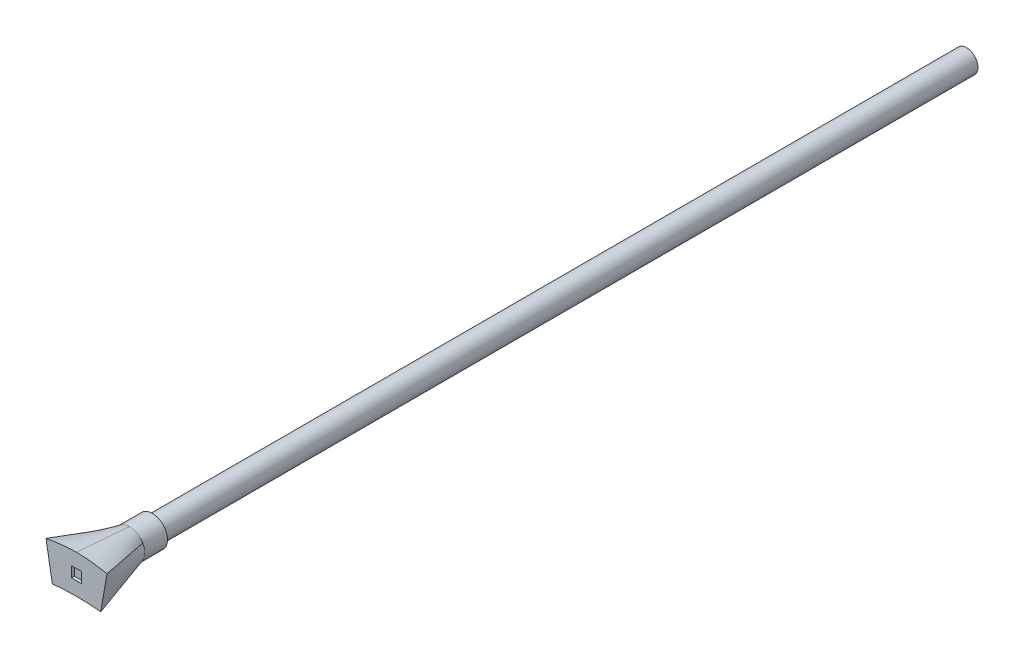
ISO-10303-21;
HEADER;
FILE_DESCRIPTION(('STEP AP214'),'2;1');
FILE_NAME('part.step','',(''),(''),'','','');
FILE_SCHEMA(('AUTOMOTIVE_DESIGN { 1 0 10303 214 1 1 1 1 }'));
ENDSEC;
DATA;
#1=APPLICATION_CONTEXT('core data for automotive mechanical design processes');
#2=APPLICATION_PROTOCOL_DEFINITION('international standard','automotive_design',2000,#1);
#3=PRODUCT_CONTEXT('',#1,'mechanical');
#4=PRODUCT('Part','Part','',(#3));
#5=PRODUCT_RELATED_PRODUCT_CATEGORY('part','',(#4));
#6=PRODUCT_DEFINITION_FORMATION('','',#4);
#7=PRODUCT_DEFINITION_CONTEXT('part definition',#1,'design');
#8=PRODUCT_DEFINITION('design','',#6,#7);
#9=PRODUCT_DEFINITION_SHAPE('','',#8);
#10=(LENGTH_UNIT() NAMED_UNIT(*) SI_UNIT(.MILLI.,.METRE.));
#11=(NAMED_UNIT(*) PLANE_ANGLE_UNIT() SI_UNIT($,.RADIAN.));
#12=(NAMED_UNIT(*) SI_UNIT($,.STERADIAN.) SOLID_ANGLE_UNIT());
#13=UNCERTAINTY_MEASURE_WITH_UNIT(LENGTH_MEASURE(1.E-05),#10,'distance_accuracy_value','');
#14=(GEOMETRIC_REPRESENTATION_CONTEXT(3) GLOBAL_UNCERTAINTY_ASSIGNED_CONTEXT((#13)) GLOBAL_UNIT_ASSIGNED_CONTEXT((#10,
#11,#12)) REPRESENTATION_CONTEXT('',''));
#15=CARTESIAN_POINT('',(0.,0.,0.));
#16=DIRECTION('',(0.,0.,1.));
#17=DIRECTION('',(1.,0.,0.));
#18=AXIS2_PLACEMENT_3D('',#15,#16,#17);
#19=CARTESIAN_POINT('',(0.,0.,19.05));
#20=DIRECTION('',(0.,0.,-1.));
#21=DIRECTION('',(-1.,0.,0.));
#22=AXIS2_PLACEMENT_3D('',#19,#20,#21);
#23=CYLINDRICAL_SURFACE('',#22,12.7);
#24=CARTESIAN_POINT('',(11.0617453760948,6.23921383144101,19.0499999999988));
#25=CARTESIAN_POINT('',(10.9739788417862,6.3948181918106,19.0499986454144));
#26=CARTESIAN_POINT('',(10.8829394737692,6.5485515730822,19.049957718009));
#27=CARTESIAN_POINT('',(10.6944584569805,6.85204164281813,19.049836086506));
#28=CARTESIAN_POINT('',(10.5970168251595,7.00179834180964,19.0497553825137));
#29=CARTESIAN_POINT('',(10.2953566779419,7.44467356859069,19.0495127015597));
#30=CARTESIAN_POINT('',(10.0817558165647,7.73148069818326,19.049350112785));
#31=CARTESIAN_POINT('',(9.63142797315353,8.28570959661795,19.0491976016052));
#32=CARTESIAN_POINT('',(9.3947281160771,8.5531534754554,19.049207479044));
#33=CARTESIAN_POINT('',(8.89964856640799,9.06716950115277,19.0494280769229));
#34=CARTESIAN_POINT('',(8.64126920886346,9.31374197045385,19.0496387942597));
#35=CARTESIAN_POINT('',(8.10456942188548,9.78434402203334,19.0501733767819));
#36=CARTESIAN_POINT('',(7.82624151863142,10.0083650789321,19.0504972845526));
#37=CARTESIAN_POINT('',(7.25170629275529,10.4321703787583,19.0510906694655));
#38=CARTESIAN_POINT('',(6.95549896535298,10.6319546152058,19.0513601465932));
#39=CARTESIAN_POINT('',(6.3471651931677,11.0059548567259,19.0516597994188));
#40=CARTESIAN_POINT('',(6.03503122296685,11.1801586212926,19.0516898609179));
#41=CARTESIAN_POINT('',(5.39720827277037,11.5016380472357,19.0514007262896));
#42=CARTESIAN_POINT('',(5.07151988988737,11.6489148932855,19.0510815455318));
#43=CARTESIAN_POINT('',(4.40863702087541,11.9156055777344,19.0501742896694));
#44=CARTESIAN_POINT('',(4.07143382760938,12.0349977708073,19.0495860067165));
#45=CARTESIAN_POINT('',(3.38809965216231,12.2449396315873,19.0484869246355));
#46=CARTESIAN_POINT('',(3.04196722080118,12.3354845852603,19.0479761381784));
#47=CARTESIAN_POINT('',(2.34399018645312,12.48691383183,19.0475120317236));
#48=CARTESIAN_POINT('',(1.99215785939795,12.5478548750066,19.0475576407036));
#49=CARTESIAN_POINT('',(1.2847672919669,12.6398755045937,19.04830132989));
#50=CARTESIAN_POINT('',(0.92921154654075,12.6709739365487,19.0489989977726));
#51=CARTESIAN_POINT('',(0.477602222869076,12.6913770159873,19.0496456995967));
#52=CARTESIAN_POINT('',(0.382058146175667,12.6946121448966,19.049768958844));
#53=CARTESIAN_POINT('',(0.191012437071813,12.6989222709764,19.0499465172618));
#54=CARTESIAN_POINT('',(0.0955108511663123,12.6999993265936,19.0500008821281));
#55=CARTESIAN_POINT('',(0.,12.7,19.05));
#56=B_SPLINE_CURVE_WITH_KNOTS('',3,(#24,#25,#26,#27,#28,#29,#30,#31,#32,#33,#34,#35,#36,#37,#38,
#39,#40,#41,#42,#43,#44,#45,#46,#47,#48,#49,#50,#51,#52,#53,#54,#55),.UNSPECIFIED.,.F.,.F.,(4,2,
2,2,2,2,2,2,2,2,2,2,2,2,2,4),(0.,0.535865592469261,1.07172976623893,2.14317151654725,
3.21336988476865,4.28355171654032,5.35413661446469,6.42472179862206,7.49581761046627,
8.5668662871633,9.63874361727017,10.7107960170752,11.780785117096,12.8500980757911,
13.1368797030643,13.4233876574297),.UNSPECIFIED.);
#57=CARTESIAN_POINT('',(11.0617453760948,6.23921383144102,19.0499999999994));
#58=VERTEX_POINT('',#57);
#59=CARTESIAN_POINT('',(0.,12.7,19.05));
#60=VERTEX_POINT('',#59);
#61=EDGE_CURVE('E13',#58,#60,#56,.T.);
#62=ORIENTED_EDGE('',*,*,#61,.F.);
#63=CARTESIAN_POINT('',(9.98432174422343,-7.84877820477985,19.0499999999986));
#64=CARTESIAN_POINT('',(10.0947074322599,-7.70835782816366,19.0499982149685));
#65=CARTESIAN_POINT('',(10.202117145473,-7.56562570157693,19.0499220872172));
#66=CARTESIAN_POINT('',(10.4108223415146,-7.27575987072526,19.0496901347566));
#67=CARTESIAN_POINT('',(10.5121178418753,-7.12862617908342,19.049534310276));
#68=CARTESIAN_POINT('',(10.8065380100603,-6.68103425059688,19.0490508591596));
#69=CARTESIAN_POINT('',(10.9902555784524,-6.37430979168048,19.04870718007));
#70=CARTESIAN_POINT('',(11.3310339129066,-5.74674773018184,19.0483044638673));
#71=CARTESIAN_POINT('',(11.4881148378943,-5.42592103399788,19.0482452105614));
#72=CARTESIAN_POINT('',(11.7747067237314,-4.77217354256562,19.048474010627));
#73=CARTESIAN_POINT('',(11.9042180682093,-4.4392529156789,19.0487620591653));
#74=CARTESIAN_POINT('',(12.1347896988743,-3.76355791961527,19.0495362648761));
#75=CARTESIAN_POINT('',(12.2358387418217,-3.42077971523798,19.0500225001516));
#76=CARTESIAN_POINT('',(12.408703336238,-2.72792305548544,19.0509373291676));
#77=CARTESIAN_POINT('',(12.4805184345089,-2.37784448702505,19.0513659220144));
#78=CARTESIAN_POINT('',(12.5944019929594,-1.67287959098178,19.0519479985728));
#79=CARTESIAN_POINT('',(12.6364702677718,-1.31799323345322,19.0521014805701));
#80=CARTESIAN_POINT('',(12.6905597965421,-0.60594754563145,19.0520671283552));
#81=CARTESIAN_POINT('',(12.7025818422984,-0.248788275484218,19.0518793031374));
#82=CARTESIAN_POINT('',(12.6964943921573,0.465413424759226,19.0512718640421));
#83=CARTESIAN_POINT('',(12.67837308892,0.822455754251545,19.0508521593789));
#84=CARTESIAN_POINT('',(12.6121059632777,1.53374230838033,19.0499987464845));
#85=CARTESIAN_POINT('',(12.5639601451378,1.88798653341426,19.0495650382554));
#86=CARTESIAN_POINT('',(12.4380235938977,2.59094293357662,19.0488962501666));
#87=CARTESIAN_POINT('',(12.3602512006582,2.93965839237449,19.0486610477141));
#88=CARTESIAN_POINT('',(12.1756516053531,3.6291674917987,19.0484911207745));
#89=CARTESIAN_POINT('',(12.0688347050957,3.96996389480491,19.048556289879));
#90=CARTESIAN_POINT('',(11.8274052027731,4.63989796089859,19.0489151926206));
#91=CARTESIAN_POINT('',(11.6929184819473,4.96908077929731,19.0492079072562));
#92=CARTESIAN_POINT('',(11.4710388461477,5.45313937343557,19.0496136494661));
#93=CARTESIAN_POINT('',(11.3937964407824,5.61273868672026,19.0497432438765));
#94=CARTESIAN_POINT('',(11.2326992450724,5.92856509482665,19.0499356533865));
#95=CARTESIAN_POINT('',(11.1488444353118,6.08479217974487,19.04999846829));
#96=CARTESIAN_POINT('',(11.0617453760948,6.23921383144102,19.05));
#97=B_SPLINE_CURVE_WITH_KNOTS('',3,(#63,#64,#65,#66,#67,#68,#69,#70,#71,#72,#73,#74,#75,#76,#77,
#78,#79,#80,#81,#82,#83,#84,#85,#86,#87,#88,#89,#90,#91,#92,#93,#94,#95,#96),.UNSPECIFIED.,.F.,
.F.,(4,2,2,2,2,2,2,2,2,2,2,2,2,2,2,2,4),(0.,0.535758127316124,1.07151471829853,2.14274124687154,
3.21315340485264,4.28355066715854,5.35437016899396,6.42520627053013,7.49604904491903,
8.56686359944703,9.63809769757,10.709331643522,11.7799035338888,12.8500961968794,
13.915523705747,14.4473154175712,14.9791086909357),.UNSPECIFIED.);
#98=CARTESIAN_POINT('',(9.98432174422343,-7.84877820477985,19.0499999999993));
#99=VERTEX_POINT('',#98);
#100=EDGE_CURVE('E143',#99,#58,#97,.T.);
#101=ORIENTED_EDGE('',*,*,#100,.F.);
#102=CARTESIAN_POINT('',(-9.98432175053944,-7.84877819674534,19.05));
#103=CARTESIAN_POINT('',(-9.87395035921762,-7.98918394545673,19.0500048293865));
#104=CARTESIAN_POINT('',(-9.76061385534174,-8.12725837412813,19.0500478831314));
#105=CARTESIAN_POINT('',(-9.52822039169119,-8.39850555346625,19.050145259999));
#106=CARTESIAN_POINT('',(-9.4091634479133,-8.53167831783826,19.0501995830903));
#107=CARTESIAN_POINT('',(-9.16554385942837,-8.7928779086951,19.0502543188085));
#108=CARTESIAN_POINT('',(-9.0409814683251,-8.92090497169465,19.0502547339161));
#109=CARTESIAN_POINT('',(-8.78656953033371,-9.17159141189537,19.0501880014873));
#110=CARTESIAN_POINT('',(-8.65671998819074,-9.29425079391377,19.0501208540116));
#111=CARTESIAN_POINT('',(-8.39205107266326,-9.5339037980271,19.0499446189727));
#112=CARTESIAN_POINT('',(-8.25723519490829,-9.65090127603472,19.0498355604181));
#113=CARTESIAN_POINT('',(-7.98280711305333,-9.87910194556335,19.0497362541828));
#114=CARTESIAN_POINT('',(-7.84319490705643,-9.9903051347927,19.0497460065492));
#115=CARTESIAN_POINT('',(-7.41749898219359,-10.3149392808463,19.0498974473505));
#116=CARTESIAN_POINT('',(-7.12449372306841,-10.5194511580482,19.0501612667526));
#117=CARTESIAN_POINT('',(-6.67291072184832,-10.8071362585419,19.0502369769291));
#118=CARTESIAN_POINT('',(-6.52031648063487,-10.8998791853501,19.0502088129738));
#119=CARTESIAN_POINT('',(-6.21133965656885,-11.0788589950823,19.0500634426523));
#120=CARTESIAN_POINT('',(-6.05495707270867,-11.1650958762759,19.0499462362624));
#121=CARTESIAN_POINT('',(-5.73869705707368,-11.3308975951669,19.0497621979135));
#122=CARTESIAN_POINT('',(-5.57881959032027,-11.4104623660479,19.0496953664589));
#123=CARTESIAN_POINT('',(-5.25585119527976,-11.5627809610852,19.0497649863354));
#124=CARTESIAN_POINT('',(-5.09276026699874,-11.6355347852545,19.0499014376662));
#125=CARTESIAN_POINT('',(-4.76368887444467,-11.774087388611,19.0501533754555));
#126=CARTESIAN_POINT('',(-4.5977089903416,-11.8398875459087,19.0502688660714));
#127=CARTESIAN_POINT('',(-4.26312288082602,-11.964432619786,19.0503655784278));
#128=CARTESIAN_POINT('',(-4.09451665597224,-12.0231775378665,19.0503468001968));
#129=CARTESIAN_POINT('',(-3.75497860723364,-12.1335073363647,19.0501523215475));
#130=CARTESIAN_POINT('',(-3.58404679372752,-12.1850922487248,19.0499766218294));
#131=CARTESIAN_POINT('',(-3.24016063370365,-12.2810106895732,19.0495922424841));
#132=CARTESIAN_POINT('',(-3.06720628817156,-12.3253442215953,19.049383562873));
#133=CARTESIAN_POINT('',(-2.7195748585284,-12.4066828679954,19.049347768238));
#134=CARTESIAN_POINT('',(-2.54489770018061,-12.443687665114,19.0495206697287));
#135=CARTESIAN_POINT('',(-2.19413895453811,-12.5103006250418,19.0499896429305));
#136=CARTESIAN_POINT('',(-2.01805736632209,-12.5399087829983,19.0502857147225));
#137=CARTESIAN_POINT('',(-1.6648015242991,-12.5916759340817,19.0507295738543));
#138=CARTESIAN_POINT('',(-1.48762726827814,-12.6138349121099,19.0508773608936));
#139=CARTESIAN_POINT('',(-1.13250364793299,-12.6506641722162,19.0509263837227));
#140=CARTESIAN_POINT('',(-0.954554283563903,-12.6653344538606,19.0508276194982));
#141=CARTESIAN_POINT('',(-0.59816967409565,-12.6871614451848,19.0504874570159));
#142=CARTESIAN_POINT('',(-0.419734376794099,-12.6943173128918,19.0502460427792));
#143=CARTESIAN_POINT('',(-0.151985378624551,-12.699404359487,19.0500370681141));
#144=CARTESIAN_POINT('',(-0.062717230034155,-12.7001588585465,19.0499929352395));
#145=CARTESIAN_POINT('',(0.115815123752412,-12.6997856416623,19.050010130774));
#146=CARTESIAN_POINT('',(0.205079328948386,-12.6986579256249,19.0500714591884));
#147=CARTESIAN_POINT('',(0.472804302526955,-12.6924514939468,19.0503126795907));
#148=CARTESIAN_POINT('',(0.651207729376863,-12.6845496902861,19.0505498072091));
#149=CARTESIAN_POINT('',(1.00751708392558,-12.6612316548161,19.0508624105327));
#150=CARTESIAN_POINT('',(1.18542301183779,-12.6458154262306,19.0509378863072));
#151=CARTESIAN_POINT('',(1.54039842891744,-12.6074991576895,19.050844228276));
#152=CARTESIAN_POINT('',(1.71746805344756,-12.5846003741206,19.0506751355193));
#153=CARTESIAN_POINT('',(2.0704840184108,-12.5313590760239,19.0502047276673));
#154=CARTESIAN_POINT('',(2.24643035837064,-12.50101655836,19.0499034125164));
#155=CARTESIAN_POINT('',(2.59688939130647,-12.4329412863621,19.0494684076311));
#156=CARTESIAN_POINT('',(2.7714020745711,-12.3952084820103,19.0493347190312));
#157=CARTESIAN_POINT('',(3.11868089585485,-12.3124203520462,19.0494245984171));
#158=CARTESIAN_POINT('',(3.29144703327786,-12.2673650239348,19.0496481665247));
#159=CARTESIAN_POINT('',(3.63496680470731,-12.1699996323629,19.0500324997879));
#160=CARTESIAN_POINT('',(3.8057199898001,-12.1176879826596,19.0501932511822));
#161=CARTESIAN_POINT('',(4.14485888542338,-12.0059165479417,19.0503598761215));
#162=CARTESIAN_POINT('',(4.31324459631055,-11.946456764004,19.0503657496899));
#163=CARTESIAN_POINT('',(4.81438911394141,-11.7575112996825,19.0501701669759));
#164=CARTESIAN_POINT('',(5.14322160145004,-11.617435035484,19.0497556169878));
#165=CARTESIAN_POINT('',(5.78808127132267,-11.3099856118314,19.0496828334225));
#166=CARTESIAN_POINT('',(6.10410160835653,-11.1425980942403,19.0500249988619));
#167=CARTESIAN_POINT('',(6.56665718631587,-10.8720265474985,19.050221426121));
#168=CARTESIAN_POINT('',(6.71895497999108,-10.7785699853086,19.0502340734189));
#169=CARTESIAN_POINT('',(7.01948077821934,-10.5853103485096,19.0501740076425));
#170=CARTESIAN_POINT('',(7.16770881714117,-10.4855073275195,19.0501012952892));
#171=CARTESIAN_POINT('',(7.45964692014899,-10.2798596129013,19.0499263944043));
#172=CARTESIAN_POINT('',(7.603362117122,-10.1740221995663,19.0498242408133));
#173=CARTESIAN_POINT('',(7.88621027554022,-9.95638135059663,19.0497338201437));
#174=CARTESIAN_POINT('',(8.02534309400179,-9.8445777290835,19.0497455566155));
#175=CARTESIAN_POINT('',(8.29871682515467,-9.61525443258104,19.0498655671291));
#176=CARTESIAN_POINT('',(8.43295971792323,-9.49773711727431,19.0499738016333));
#177=CARTESIAN_POINT('',(8.69636280272975,-9.25716384179172,19.0501427951548));
#178=CARTESIAN_POINT('',(8.82552359757232,-9.13410854222911,19.0502035598188));
#179=CARTESIAN_POINT('',(9.04395164325642,-8.9170473923531,19.0502502223838));
#180=CARTESIAN_POINT('',(9.13447125575023,-8.82429760431558,19.0502520469544));
#181=CARTESIAN_POINT('',(9.31261060482603,-8.63609101765876,19.0502257181119));
#182=CARTESIAN_POINT('',(9.40023098973363,-8.54063483323155,19.0501975714483));
#183=CARTESIAN_POINT('',(9.57235711768014,-8.34725729579557,19.0501292042949));
#184=CARTESIAN_POINT('',(9.65686809186389,-8.2493405979293,19.0500890052323));
#185=CARTESIAN_POINT('',(9.82287860244088,-8.05094985127519,19.0500250365466));
#186=CARTESIAN_POINT('',(9.90437746638751,-7.95047523979357,19.0500012705715));
#187=CARTESIAN_POINT('',(9.98432174422343,-7.84877820477985,19.05));
#188=B_SPLINE_CURVE_WITH_KNOTS('',3,(#102,#103,#104,#105,#106,#107,#108,#109,#110,#111,#112,
#113,#114,#115,#116,#117,#118,#119,#120,#121,#122,#123,#124,#125,#126,#127,#128,#129,#130,#131,
#132,#133,#134,#135,#136,#137,#138,#139,#140,#141,#142,#143,#144,#145,#146,#147,#148,#149,#150,
#151,#152,#153,#154,#155,#156,#157,#158,#159,#160,#161,#162,#163,#164,#165,#166,#167,#168,#169,
#170,#171,#172,#173,#174,#175,#176,#177,#178,#179,#180,#181,#182,#183,#184,#185,#186,#187),
.UNSPECIFIED.,.F.,.F.,(4,2,2,2,2,2,2,2,2,2,2,2,2,2,2,2,2,2,2,2,2,2,2,2,2,2,2,2,2,2,2,2,2,2,2,2,
2,2,2,2,2,2,4),(0.,0.535740013597807,1.07147852912538,1.60719239197959,2.14290577404692,
2.67824903273837,3.21359250315688,4.28402835585035,4.81961139845689,5.35519458351693,
5.89078313142664,6.42637167832302,6.96185387990535,7.49733596756968,8.03281566625247,
8.56829510398459,9.10379771744006,9.63930068221313,10.1748047323851,10.7103088135712,
11.2458728903559,11.5136697637436,11.7814666504575,12.3170295418028,12.8525922033829,
13.3880649854604,13.9235379931406,14.4590146250489,14.9944914397135,15.5300854954261,
16.0656794704432,17.1365991920753,18.2080837450391,18.744009542973,19.2799308136597,
19.815218659646,20.3505231923882,20.8856084985369,21.420630143918,21.8093754958466,
22.1980333207762,22.5860042281478,22.9740612322799),.UNSPECIFIED.);
#189=CARTESIAN_POINT('',(-9.98432175053944,-7.84877819674534,19.0499999999993));
#190=VERTEX_POINT('',#189);
#191=EDGE_CURVE('E314',#190,#99,#188,.T.);
#192=ORIENTED_EDGE('',*,*,#191,.F.);
#193=CARTESIAN_POINT('',(-11.0617453735136,6.23921383601744,19.05));
#194=CARTESIAN_POINT('',(-11.149494895968,6.08363894092529,19.0499984204196));
#195=CARTESIAN_POINT('',(-11.2339514519053,5.9262316807099,19.0499346913183));
#196=CARTESIAN_POINT('',(-11.3961502937103,5.60799976237697,19.0497398744312));
#197=CARTESIAN_POINT('',(-11.4738927379075,5.44717518495674,19.0496087882344));
#198=CARTESIAN_POINT('',(-11.6968241659666,4.96001883303336,19.0491999640762));
#199=CARTESIAN_POINT('',(-11.8317624991268,4.6289241842102,19.0489066011742));
#200=CARTESIAN_POINT('',(-12.0731462247395,3.95683955053911,19.0485520959086));
#201=CARTESIAN_POINT('',(-12.1796131999711,3.61585727962344,19.0484907771771));
#202=CARTESIAN_POINT('',(-12.363458729927,2.92613173323989,19.0486681634559));
#203=CARTESIAN_POINT('',(-12.4408376901779,2.5773885660413,19.0489068642833));
#204=CARTESIAN_POINT('',(-12.5659768241646,1.87449057320355,19.0495802911119));
#205=CARTESIAN_POINT('',(-12.6137253918364,1.52033368262128,19.05001509381));
#206=CARTESIAN_POINT('',(-12.6792192663297,0.809247936233524,19.0508677886834));
#207=CARTESIAN_POINT('',(-12.6969639282749,0.452319021014321,19.051285680495));
#208=CARTESIAN_POINT('',(-12.7023212896469,-0.261766092237105,19.0518876067164));
#209=CARTESIAN_POINT('',(-12.689933890667,-0.618922291007791,19.0520716403624));
#210=CARTESIAN_POINT('',(-12.635115881196,-1.33091207445716,19.052098086039));
#211=CARTESIAN_POINT('',(-12.5926860660879,-1.68574572037521,19.0519405071138));
#212=CARTESIAN_POINT('',(-12.4780623642495,-2.39072004827965,19.0513520087578));
#213=CARTESIAN_POINT('',(-12.4058564392601,-2.74085877296033,19.0509209787349));
#214=CARTESIAN_POINT('',(-12.2321958937689,-3.4337972688677,19.050004490871));
#215=CARTESIAN_POINT('',(-12.1307418999209,-3.77659719716258,19.0495190341961));
#216=CARTESIAN_POINT('',(-11.8993742659172,-4.45222514335553,19.0487495106054));
#217=CARTESIAN_POINT('',(-11.7694779491809,-4.78505909158756,19.0484653215473));
#218=CARTESIAN_POINT('',(-11.4821729431744,-5.43847898398391,19.048245131889));
#219=CARTESIAN_POINT('',(-11.324774017993,-5.75906922590091,19.0483090079594));
#220=CARTESIAN_POINT('',(-10.98427739997,-6.38449811426487,19.0487171749772));
#221=CARTESIAN_POINT('',(-10.8012973854606,-6.68940060290919,19.0490602147198));
#222=CARTESIAN_POINT('',(-10.5083906839323,-7.13408618034779,19.0495400831682));
#223=CARTESIAN_POINT('',(-10.4077781683788,-7.28008143245969,19.0496941380852));
#224=CARTESIAN_POINT('',(-10.2005284555649,-7.56773652484108,19.0499232322972));
#225=CARTESIAN_POINT('',(-10.0938911156264,-7.70939626231562,19.0499982697201));
#226=CARTESIAN_POINT('',(-9.98432175053944,-7.84877819674533,19.0499999999986));
#227=B_SPLINE_CURVE_WITH_KNOTS('',3,(#193,#194,#195,#196,#197,#198,#199,#200,#201,#202,#203,
#204,#205,#206,#207,#208,#209,#210,#211,#212,#213,#214,#215,#216,#217,#218,#219,#220,#221,#222,
#223,#224,#225,#226),.UNSPECIFIED.,.F.,.F.,(4,2,2,2,2,2,2,2,2,2,2,2,2,2,2,2,4),(0.,
0.535763556648713,1.07151447568519,2.14274079977388,3.21315276145027,4.28354979957029,
5.35436584219643,6.4252048996643,7.49604745432738,8.56686165913334,9.63810921122967,
10.7093338130433,11.7799077680129,12.8501024128381,13.9155267176359,14.4473114013094,
14.9791086838324),.UNSPECIFIED.);
#228=CARTESIAN_POINT('',(-11.0617445680518,6.23921526405154,19.05));
#229=VERTEX_POINT('',#228);
#230=EDGE_CURVE('E117',#229,#190,#227,.T.);
#231=ORIENTED_EDGE('',*,*,#230,.F.);
#232=CARTESIAN_POINT('',(0.,12.7,19.05));
#233=CARTESIAN_POINT('',(-0.178636662426801,12.7000021321541,19.0499865392157));
#234=CARTESIAN_POINT('',(-0.357271466535203,12.696230974677,19.0498088406819));
#235=CARTESIAN_POINT('',(-0.714222554271383,12.681158579086,19.0493156728482));
#236=CARTESIAN_POINT('',(-0.892538838640341,12.669857358517,19.0490002038693));
#237=CARTESIAN_POINT('',(-1.24853067716475,12.6397420323977,19.0484222114191));
#238=CARTESIAN_POINT('',(-1.42620626060327,12.6209282747125,19.0481596854971));
#239=CARTESIAN_POINT('',(-1.7805938274483,12.5758261431733,19.0477737703951));
#240=CARTESIAN_POINT('',(-1.95730581207231,12.5495377787656,19.0476503810392));
#241=CARTESIAN_POINT('',(-2.48512231552769,12.4595906330166,19.0475342118869));
#242=CARTESIAN_POINT('',(-2.83440066676617,12.3848079875042,19.0477943892917));
#243=CARTESIAN_POINT('',(-3.52536727886118,12.2061121188355,19.0486606162674));
#244=CARTESIAN_POINT('',(-3.86705565256408,12.1021993290941,19.0492666606926));
#245=CARTESIAN_POINT('',(-4.54060745472155,11.8659295314617,19.0503614927725));
#246=CARTESIAN_POINT('',(-4.87246723243687,11.7335621014591,19.0508502373245));
#247=CARTESIAN_POINT('',(-5.52386267436183,11.4413451145225,19.0514918506715));
#248=CARTESIAN_POINT('',(-5.84339809218697,11.2814950085123,19.051644712755));
#249=CARTESIAN_POINT('',(-6.46801709375002,10.9353692199295,19.0516356600251));
#250=CARTESIAN_POINT('',(-6.77309386170141,10.7490812366531,19.0514735982396));
#251=CARTESIAN_POINT('',(-7.36645187204857,10.3514696197451,19.0509928918643));
#252=CARTESIAN_POINT('',(-7.6547338493995,10.1401470828777,19.0506742541323));
#253=CARTESIAN_POINT('',(-8.21270440186314,9.69377344334614,19.0500667471077));
#254=CARTESIAN_POINT('',(-8.48237689245129,9.45870223610466,19.0497779034627));
#255=CARTESIAN_POINT('',(-9.00093663240089,8.96665388506691,19.049367539258));
#256=CARTESIAN_POINT('',(-9.24982414052422,8.70967701406491,19.0492460166148));
#257=CARTESIAN_POINT('',(-9.72459578600884,8.17615695357842,19.0492070077831));
#258=CARTESIAN_POINT('',(-9.95052133083421,7.89965056547048,19.0492891472803));
#259=CARTESIAN_POINT('',(-10.3781940649318,7.32872198321476,19.04956442626));
#260=CARTESIAN_POINT('',(-10.5799564558235,7.03431123081513,19.0497574955058));
#261=CARTESIAN_POINT('',(-10.8195934792925,6.65098127308827,19.0499177184505));
#262=CARTESIAN_POINT('',(-10.8693512391017,6.56934928751186,19.0499468025896));
#263=CARTESIAN_POINT('',(-10.9669642921472,6.4050610668462,19.0499879663643));
#264=CARTESIAN_POINT('',(-11.0148213558422,6.32240588370183,19.0500000622031));
#265=CARTESIAN_POINT('',(-11.0617453735136,6.23921383601744,19.0499999999988));
#266=B_SPLINE_CURVE_WITH_KNOTS('',3,(#232,#233,#234,#235,#236,#237,#238,#239,#240,#241,#242,
#243,#244,#245,#246,#247,#248,#249,#250,#251,#252,#253,#254,#255,#256,#257,#258,#259,#260,#261,
#262,#263,#264,#265),.UNSPECIFIED.,.F.,.F.,(4,2,2,2,2,2,2,2,2,2,2,2,2,2,2,2,4),(0.,
0.53586666422997,1.07173207989289,1.60757268540064,2.14341261372297,3.21361204089294,
4.28379554587228,5.35437169801904,6.42496924168507,7.49606654339753,8.56711693766491,
9.63908175702163,10.711033229002,11.7810160036478,12.8503220503481,13.1371109823836,
13.4236261923024),.UNSPECIFIED.);
#267=EDGE_CURVE('E156',#60,#229,#266,.T.);
#268=ORIENTED_EDGE('',*,*,#267,.F.);
#269=EDGE_LOOP('',(#62,#101,#192,#231,#268));
#270=FACE_BOUND('',#269,.T.);
#271=CARTESIAN_POINT('',(0.,0.,0.));
#272=DIRECTION('',(0.,0.,1.));
#273=DIRECTION('',(1.,0.,0.));
#274=AXIS2_PLACEMENT_3D('',#271,#272,#273);
#275=CIRCLE('',#274,12.7);
#276=CARTESIAN_POINT('',(12.7,0.,0.));
#277=VERTEX_POINT('',#276);
#278=EDGE_CURVE('E126',#277,#277,#275,.T.);
#279=ORIENTED_EDGE('',*,*,#278,.T.);
#280=EDGE_LOOP('',(#279));
#281=FACE_BOUND('',#280,.T.);
#282=ADVANCED_FACE('F113',(#270,#281),#23,.T.);
#283=CARTESIAN_POINT('',(0.,0.,0.));
#284=DIRECTION('',(0.,0.,1.));
#285=DIRECTION('',(1.,0.,0.));
#286=AXIS2_PLACEMENT_3D('',#283,#284,#285);
#287=PLANE('',#286);
#288=ORIENTED_EDGE('',*,*,#278,.F.);
#289=EDGE_LOOP('',(#288));
#290=FACE_BOUND('',#289,.T.);
#291=ADVANCED_FACE('F392',(#290),#287,.F.);
#292=CARTESIAN_POINT('',(-13.1042680107958,15.4501035656534,63.5));
#293=DIRECTION('',(0.,0.,1.));
#294=DIRECTION('',(1.,0.,0.));
#295=AXIS2_PLACEMENT_3D('',#292,#293,#294);
#296=PLANE('',#295);
#297=DIRECTION('',(0.,1.,0.));
#298=VECTOR('',#297,1.);
#299=CARTESIAN_POINT('',(4.35596431939353,-4.4506591959047,63.5));
#300=LINE('',#299,#298);
#301=CARTESIAN_POINT('',(4.35596431939353,-4.4506591959047,63.5));
#302=VERTEX_POINT('',#301);
#303=CARTESIAN_POINT('',(4.35596431939353,4.4506591959047,63.5));
#304=VERTEX_POINT('',#303);
#305=EDGE_CURVE('E134',#302,#304,#300,.T.);
#306=ORIENTED_EDGE('',*,*,#305,.F.);
#307=DIRECTION('',(1.,0.,0.));
#308=VECTOR('',#307,1.);
#309=CARTESIAN_POINT('',(-4.35596431939353,-4.4506591959047,63.5));
#310=LINE('',#309,#308);
#311=CARTESIAN_POINT('',(-4.35596431939353,-4.4506591959047,63.5));
#312=VERTEX_POINT('',#311);
#313=EDGE_CURVE('E217',#312,#302,#310,.T.);
#314=ORIENTED_EDGE('',*,*,#313,.F.);
#315=DIRECTION('',(0.,-1.,0.));
#316=VECTOR('',#315,1.);
#317=CARTESIAN_POINT('',(-4.35596431939353,-4.4506591959047,63.5));
#318=LINE('',#317,#316);
#319=CARTESIAN_POINT('',(-4.35596431939353,4.4506591959047,63.5));
#320=VERTEX_POINT('',#319);
#321=EDGE_CURVE('E220',#320,#312,#318,.T.);
#322=ORIENTED_EDGE('',*,*,#321,.F.);
#323=DIRECTION('',(-1.,0.,0.));
#324=VECTOR('',#323,1.);
#325=CARTESIAN_POINT('',(-4.35596431939353,4.4506591959047,63.5));
#326=LINE('',#325,#324);
#327=EDGE_CURVE('E226',#304,#320,#326,.T.);
#328=ORIENTED_EDGE('',*,*,#327,.F.);
#329=EDGE_LOOP('',(#306,#314,#322,#328));
#330=FACE_BOUND('',#329,.T.);
#331=CARTESIAN_POINT('',(0.,16.3247724972175,63.5));
#332=CARTESIAN_POINT('',(-9.12731314743493,16.2172332527794,63.5));
#333=CARTESIAN_POINT('',(-17.2956541397405,15.0165582916401,63.5));
#334=CARTESIAN_POINT('',(-25.5652422248402,13.5746813947509,63.5));
#335=B_SPLINE_CURVE_WITH_KNOTS('',3,(#331,#332,#333,#334),.UNSPECIFIED.,.F.,.F.,(4,4),(0.,
0.531550135782911),.UNSPECIFIED.);
#336=CARTESIAN_POINT('',(0.,16.3247724972175,63.5));
#337=VERTEX_POINT('',#336);
#338=CARTESIAN_POINT('',(-25.5652422248402,13.5746813947509,63.5));
#339=VERTEX_POINT('',#338);
#340=EDGE_CURVE('E232',#337,#339,#335,.T.);
#341=ORIENTED_EDGE('',*,*,#340,.T.);
#342=DIRECTION('',(0.171767564962778,-0.985137504933579,0.));
#343=VECTOR('',#342,1.);
#344=CARTESIAN_POINT('',(-25.5652422248402,13.5746813947509,63.5));
#345=LINE('',#344,#343);
#346=CARTESIAN_POINT('',(-20.2723950070043,-16.7813541193082,63.5));
#347=VERTEX_POINT('',#346);
#348=EDGE_CURVE('E250',#339,#347,#345,.T.);
#349=ORIENTED_EDGE('',*,*,#348,.T.);
#350=CARTESIAN_POINT('',(-20.2723950070043,-16.7813541193082,63.5));
#351=CARTESIAN_POINT('',(-11.2106920451671,-15.7308227401249,63.5));
#352=CARTESIAN_POINT('',(0.,-15.7491663048478,63.5));
#353=B_SPLINE_CURVE_WITH_KNOTS('',2,(#350,#351,#352),.UNSPECIFIED.,.F.,.F.,(3,3),(0.,1.),.UNSPECIFIED.);
#354=CARTESIAN_POINT('',(0.,-15.7463969322597,63.5));
#355=VERTEX_POINT('',#354);
#356=EDGE_CURVE('E386',#347,#355,#353,.T.);
#357=ORIENTED_EDGE('',*,*,#356,.T.);
#358=CARTESIAN_POINT('',(0.,-15.7491663048478,63.5));
#359=CARTESIAN_POINT('',(11.2106920451671,-15.7308227401249,63.5));
#360=CARTESIAN_POINT('',(20.2723950070043,-16.7813541193082,63.5));
#361=B_SPLINE_CURVE_WITH_KNOTS('',2,(#358,#359,#360),.UNSPECIFIED.,.F.,.F.,(3,3),(0.,1.),.UNSPECIFIED.);
#362=CARTESIAN_POINT('',(20.2723950070043,-16.7813541193082,63.5));
#363=VERTEX_POINT('',#362);
#364=EDGE_CURVE('E376',#355,#363,#361,.T.);
#365=ORIENTED_EDGE('',*,*,#364,.T.);
#366=DIRECTION('',(0.171767564962781,0.985137504933579,0.));
#367=VECTOR('',#366,1.);
#368=CARTESIAN_POINT('',(25.5652422248403,13.5746813947508,63.5));
#369=LINE('',#368,#367);
#370=CARTESIAN_POINT('',(25.5652422248403,13.5746813947508,63.5));
#371=VERTEX_POINT('',#370);
#372=EDGE_CURVE('E357',#363,#371,#369,.T.);
#373=ORIENTED_EDGE('',*,*,#372,.T.);
#374=CARTESIAN_POINT('',(25.5652422248402,13.5746813947509,63.5));
#375=CARTESIAN_POINT('',(17.2956541397405,15.0165582916401,63.5));
#376=CARTESIAN_POINT('',(9.12731314743493,16.2172332527794,63.5));
#377=CARTESIAN_POINT('',(0.,16.3247724972175,63.5));
#378=B_SPLINE_CURVE_WITH_KNOTS('',3,(#374,#375,#376,#377),.UNSPECIFIED.,.F.,.F.,(4,4),(0.,
0.531550135782911),.UNSPECIFIED.);
#379=EDGE_CURVE('E353',#371,#337,#378,.T.);
#380=ORIENTED_EDGE('',*,*,#379,.T.);
#381=EDGE_LOOP('',(#341,#349,#357,#365,#373,#380));
#382=FACE_BOUND('',#381,.T.);
#383=ADVANCED_FACE('F325',(#330,#382),#296,.T.);
#384=CARTESIAN_POINT('',(0.,12.6637522750278,18.6055));
#385=CARTESIAN_POINT('',(0.,12.7,19.05));
#386=CARTESIAN_POINT('',(0.,16.3247724972175,63.5));
#387=CARTESIAN_POINT('',(-4.53673124959336,12.6648276674722,18.6055));
#388=CARTESIAN_POINT('',(-4.58218255551259,12.7,19.05));
#389=CARTESIAN_POINT('',(-9.12731314743493,16.2172332527794,63.5));
#390=CARTESIAN_POINT('',(-8.72577299067656,10.1824510395165,18.6055));
#391=CARTESIAN_POINT('',(-8.81062329908313,10.2303134875573,19.05));
#392=CARTESIAN_POINT('',(-17.2956541397405,15.0165582916401,63.5));
#393=CARTESIAN_POINT('',(-10.9167087779675,6.165862045059,18.6055));
#394=CARTESIAN_POINT('',(-11.06174376259,6.23921669208565,19.05));
#395=CARTESIAN_POINT('',(-25.5652422248402,13.5746813947509,63.5));
#396=CARTESIAN_POINT('',(-10.9386181358405,6.12569615511443,18.6055));
#397=CARTESIAN_POINT('',(-11.0842549672251,6.19930572413094,19.05));
#398=CARTESIAN_POINT('',(-25.6479381056912,13.560262625782,63.5));
#399=CARTESIAN_POINT('',(-10.9605274937134,6.08553026516985,18.6055));
#400=CARTESIAN_POINT('',(-11.1067661718602,6.15939475617622,19.05));
#401=CARTESIAN_POINT('',(-25.7306339865422,13.5458438568131,63.5));
#402=CARTESIAN_POINT('',(-10.9824368515863,6.04536437522528,18.6055));
#403=CARTESIAN_POINT('',(-11.1292773764952,6.1194837882215,19.05));
#404=CARTESIAN_POINT('',(-25.8133298673932,13.5314250878442,63.5));
#405=B_SPLINE_SURFACE_WITH_KNOTS('',3,1,((#384,#385,#386),(#387,#388,#389),(#390,#391,#392),
(#393,#394,#395),(#396,#397,#398),(#399,#400,#401),(#402,#403,#404)),.UNSPECIFIED.,.F.,.F.,.F.,
(4,3,4),(2,1,2),(0.,1.,1.01),(-0.01,0.,1.),.UNSPECIFIED.);
#406=DIRECTION('',(-0.306444866074838,0.154991259816095,0.939185420157806));
#407=VECTOR('',#406,1.);
#408=CARTESIAN_POINT('',(-18.3134929937151,9.90694904341827,41.275));
#409=LINE('',#408,#407);
#410=EDGE_CURVE('E239',#229,#339,#409,.T.);
#411=DIRECTION('',(0.,-0.0812773905387267,-0.996691519873233));
#412=VECTOR('',#411,1.);
#413=CARTESIAN_POINT('',(0.,14.5123862486087,41.275));
#414=LINE('',#413,#412);
#415=EDGE_CURVE('E236',#337,#60,#414,.T.);
#416=ORIENTED_EDGE('',*,*,#267,.T.);
#417=ORIENTED_EDGE('',*,*,#410,.T.);
#418=ORIENTED_EDGE('',*,*,#340,.F.);
#419=ORIENTED_EDGE('',*,*,#415,.T.);
#420=EDGE_LOOP('',(#416,#417,#418,#419));
#421=FACE_BOUND('',#420,.T.);
#422=ADVANCED_FACE('F269',(#421),#405,.T.);
#423=CARTESIAN_POINT('',(-10.9167087779675,6.165862045059,18.6055));
#424=CARTESIAN_POINT('',(-11.06174376259,6.23921669208565,19.05));
#425=CARTESIAN_POINT('',(-25.5652422248402,13.5746813947509,63.5));
#426=CARTESIAN_POINT('',(-11.5591256983031,5.06001334117643,18.6055));
#427=CARTESIAN_POINT('',(-11.6934330836997,5.11927075134873,19.05));
#428=CARTESIAN_POINT('',(-25.1241716233539,11.0450117685793,63.5));
#429=CARTESIAN_POINT('',(-12.4712268315218,2.7113379081461,18.6055));
#430=CARTESIAN_POINT('',(-12.5877694413125,2.74375706268164,19.05));
#431=CARTESIAN_POINT('',(-24.2420304203813,5.98567251623612,63.5));
#432=CARTESIAN_POINT('',(-12.7400538042536,-0.975826957783023,18.6055));
#433=CARTESIAN_POINT('',(-12.840833653874,-0.98203992218397,19.05));
#434=CARTESIAN_POINT('',(-22.9188186159222,-1.60333636227866,63.5));
#435=CARTESIAN_POINT('',(-11.9284294451502,-4.58036118068387,18.6055));
#436=CARTESIAN_POINT('',(-12.0241440725395,-4.6260243891998,19.05));
#437=CARTESIAN_POINT('',(-21.5956068114633,-9.19234524079345,63.5));
#438=CARTESIAN_POINT('',(-10.6796279146987,-6.76377532765762,18.6055));
#439=CARTESIAN_POINT('',(-10.77897284236,-6.83791304216731,19.05));
#440=CARTESIAN_POINT('',(-20.7134656084906,-14.2516844931366,63.5));
#441=CARTESIAN_POINT('',(-9.88144305925423,-7.7594498408358,18.6055));
#442=CARTESIAN_POINT('',(-9.98432377160819,-7.84877562577118,19.05));
#443=CARTESIAN_POINT('',(-20.2723950070043,-16.7813541193082,63.5));
#444=CARTESIAN_POINT('',(-9.84951566503644,-7.79927682136293,18.6055));
#445=CARTESIAN_POINT('',(-9.95253780877811,-7.88921012911533,19.05));
#446=CARTESIAN_POINT('',(-20.2547521829448,-16.8825409043551,63.5));
#447=CARTESIAN_POINT('',(-9.81758827081866,-7.83910380189006,18.6055));
#448=CARTESIAN_POINT('',(-9.92075184594804,-7.92964463245949,19.05));
#449=CARTESIAN_POINT('',(-20.2371093588854,-16.9837276894019,63.5));
#450=CARTESIAN_POINT('',(-9.78566087660088,-7.87893078241719,18.6055));
#451=CARTESIAN_POINT('',(-9.88896588311796,-7.97007913580364,19.05));
#452=CARTESIAN_POINT('',(-20.2194665348259,-17.0849144744488,63.5));
#453=B_SPLINE_SURFACE_WITH_KNOTS('',3,1,((#423,#424,#425),(#426,#427,#428),(#429,#430,#431),
(#432,#433,#434),(#435,#436,#437),(#438,#439,#440),(#441,#442,#443),(#444,#445,#446),(#447,#448,
#449),(#450,#451,#452)),.UNSPECIFIED.,.F.,.F.,.F.,(4,1,1,1,3,4),(2,1,2),(0.,0.25,0.5,0.75,1.,
1.01),(-0.01,0.,1.),.UNSPECIFIED.);
#454=DIRECTION('',(-0.221290405532703,-0.192134548066377,0.956093547650281));
#455=VECTOR('',#454,1.);
#456=CARTESIAN_POINT('',(-15.1283593893062,-12.3150648725397,41.275));
#457=LINE('',#456,#455);
#458=EDGE_CURVE('E240',#190,#347,#457,.T.);
#459=ORIENTED_EDGE('',*,*,#230,.T.);
#460=ORIENTED_EDGE('',*,*,#458,.T.);
#461=ORIENTED_EDGE('',*,*,#348,.F.);
#462=ORIENTED_EDGE('',*,*,#410,.F.);
#463=EDGE_LOOP('',(#459,#460,#461,#462));
#464=FACE_BOUND('',#463,.T.);
#465=ADVANCED_FACE('F256',(#464),#453,.T.);
#466=CARTESIAN_POINT('',(10.9824368515863,6.04536437522524,18.6055));
#467=CARTESIAN_POINT('',(11.1292773764953,6.11948378822147,19.05));
#468=CARTESIAN_POINT('',(25.8133298673932,13.5314250878442,63.5));
#469=CARTESIAN_POINT('',(10.9605274937134,6.08553026516982,18.6055));
#470=CARTESIAN_POINT('',(11.1067661718602,6.15939475617619,19.05));
#471=CARTESIAN_POINT('',(25.7306339865422,13.5458438568131,63.5));
#472=CARTESIAN_POINT('',(10.9386181358405,6.1256961551144,18.6055));
#473=CARTESIAN_POINT('',(11.0842549672251,6.19930572413091,19.05));
#474=CARTESIAN_POINT('',(25.6479381056912,13.560262625782,63.5));
#475=CARTESIAN_POINT('',(10.9167087779676,6.16586204505897,18.6055));
#476=CARTESIAN_POINT('',(11.0617437625901,6.23921669208562,19.05));
#477=CARTESIAN_POINT('',(25.5652422248402,13.5746813947509,63.5));
#478=CARTESIAN_POINT('',(8.72577299067658,10.1824510395165,18.6055));
#479=CARTESIAN_POINT('',(8.81062329908315,10.2303134875573,19.05));
#480=CARTESIAN_POINT('',(17.2956541397405,15.0165582916401,63.5));
#481=CARTESIAN_POINT('',(4.53673124959337,12.6648276674722,18.6055));
#482=CARTESIAN_POINT('',(4.5821825555126,12.7,19.05));
#483=CARTESIAN_POINT('',(9.12731314743493,16.2172332527794,63.5));
#484=CARTESIAN_POINT('',(0.,12.6637522750278,18.6055));
#485=CARTESIAN_POINT('',(0.,12.7,19.05));
#486=CARTESIAN_POINT('',(0.,16.3247724972175,63.5));
#487=B_SPLINE_SURFACE_WITH_KNOTS('',3,1,((#466,#467,#468),(#469,#470,#471),(#472,#473,#474),
(#475,#476,#477),(#478,#479,#480),(#481,#482,#483),(#484,#485,#486)),.UNSPECIFIED.,.F.,.F.,.F.,
(4,3,4),(2,1,2),(-0.01,0.,1.),(-0.01,0.,1.),.UNSPECIFIED.);
#488=DIRECTION('',(0.306444866074838,0.154991259816094,0.939185420157806));
#489=VECTOR('',#488,1.);
#490=CARTESIAN_POINT('',(18.3134929937152,9.90694904341822,41.275));
#491=LINE('',#490,#489);
#492=EDGE_CURVE('E340',#58,#371,#491,.T.);
#493=ORIENTED_EDGE('',*,*,#61,.T.);
#494=ORIENTED_EDGE('',*,*,#415,.F.);
#495=ORIENTED_EDGE('',*,*,#379,.F.);
#496=ORIENTED_EDGE('',*,*,#492,.F.);
#497=EDGE_LOOP('',(#493,#494,#495,#496));
#498=FACE_BOUND('',#497,.T.);
#499=ADVANCED_FACE('F268',(#498),#487,.T.);
#500=CARTESIAN_POINT('',(-9.88144305925422,-7.7594498408358,18.6055));
#501=CARTESIAN_POINT('',(-9.98432377160818,-7.84877562577118,19.05));
#502=CARTESIAN_POINT('',(-20.2723950070043,-16.7813541193082,63.5));
#503=CARTESIAN_POINT('',(-9.30068353689459,-8.52156236808543,18.6055));
#504=CARTESIAN_POINT('',(-9.39266832905532,-8.6014126969961,19.05));
#505=CARTESIAN_POINT('',(-18.5911475451279,-16.5864455880629,63.5));
#506=CARTESIAN_POINT('',(-7.96668902985664,-9.90943311812255,18.6055));
#507=CARTESIAN_POINT('',(-8.03851381133487,-9.97234522250263,19.05));
#508=CARTESIAN_POINT('',(-15.2209919591581,-16.2635556605101,63.5));
#509=CARTESIAN_POINT('',(-5.55221847520665,-11.4765134832071,18.6055));
#510=CARTESIAN_POINT('',(-5.59776768118346,-11.5207874581279,19.05));
#511=CARTESIAN_POINT('',(-10.1526882788644,-15.9481849502115,63.4999999999999));
#512=CARTESIAN_POINT('',(-2.84996249484512,-12.4497179058163,18.6055));
#513=CARTESIAN_POINT('',(-2.87201828298316,-12.4826633581942,19.05));
#514=CARTESIAN_POINT('',(-5.0775970967873,-15.7772085959828,63.5));
#515=CARTESIAN_POINT('',(-0.949998287887525,-12.6695360306774,18.6055));
#516=CARTESIAN_POINT('',(-0.957349843936093,-12.7,19.05));
#517=CARTESIAN_POINT('',(-1.69250544879288,-15.7463969322597,63.5));
#518=CARTESIAN_POINT('',(0.94999828788752,-12.6695360306774,18.6055));
#519=CARTESIAN_POINT('',(0.957349843936087,-12.7,19.05));
#520=CARTESIAN_POINT('',(1.69250544879288,-15.7463969322597,63.5));
#521=CARTESIAN_POINT('',(2.84996249484511,-12.4497179058162,18.6055));
#522=CARTESIAN_POINT('',(2.87201828298315,-12.4826633581941,19.05));
#523=CARTESIAN_POINT('',(5.07759709678729,-15.7772085959827,63.5000000000001));
#524=CARTESIAN_POINT('',(5.55221847520665,-11.4765134832071,18.6055));
#525=CARTESIAN_POINT('',(5.59776768118346,-11.520787458128,19.05));
#526=CARTESIAN_POINT('',(10.1526882788645,-15.9481849502115,63.4999999999999));
#527=CARTESIAN_POINT('',(7.96668902985663,-9.90943311812254,18.6055));
#528=CARTESIAN_POINT('',(8.03851381133486,-9.97234522250261,19.05));
#529=CARTESIAN_POINT('',(15.2209919591581,-16.2635556605101,63.5));
#530=CARTESIAN_POINT('',(9.30068353689458,-8.52156236808544,18.6055));
#531=CARTESIAN_POINT('',(9.39266832905531,-8.6014126969961,19.05));
#532=CARTESIAN_POINT('',(18.5911475451279,-16.5864455880629,63.5));
#533=CARTESIAN_POINT('',(9.88144305925422,-7.75944984083581,18.6055));
#534=CARTESIAN_POINT('',(9.98432377160818,-7.84877562577118,19.05));
#535=CARTESIAN_POINT('',(20.2723950070043,-16.7813541193082,63.5));
#536=B_SPLINE_SURFACE_WITH_KNOTS('',3,1,((#500,#501,#502),(#503,#504,#505),(#506,#507,#508),
(#509,#510,#511),(#512,#513,#514),(#515,#516,#517),(#518,#519,#520),(#521,#522,#523),(#524,#525,
#526),(#527,#528,#529),(#530,#531,#532),(#533,#534,#535)),.UNSPECIFIED.,.F.,.F.,.F.,(4,1,1,1,2,
1,1,1,4),(2,1,2),(0.,0.125,0.25,0.375,0.5,0.625,0.75,0.875,1.),(-0.01,0.,1.),.UNSPECIFIED.);
#537=DIRECTION('',(0.221290405532704,-0.192134548066376,0.956093547650282));
#538=VECTOR('',#537,1.);
#539=CARTESIAN_POINT('',(15.1283593893062,-12.3150648725397,41.275));
#540=LINE('',#539,#538);
#541=EDGE_CURVE('E348',#99,#363,#540,.T.);
#542=ORIENTED_EDGE('',*,*,#191,.T.);
#543=ORIENTED_EDGE('',*,*,#541,.T.);
#544=ORIENTED_EDGE('',*,*,#364,.F.);
#545=ORIENTED_EDGE('',*,*,#356,.F.);
#546=ORIENTED_EDGE('',*,*,#458,.F.);
#547=EDGE_LOOP('',(#542,#543,#544,#545,#546));
#548=FACE_BOUND('',#547,.T.);
#549=ADVANCED_FACE('F285',(#548),#536,.T.);
#550=CARTESIAN_POINT('',(9.78566087660088,-7.8789307824172,18.6055));
#551=CARTESIAN_POINT('',(9.88896588311796,-7.97007913580365,19.05));
#552=CARTESIAN_POINT('',(20.2194665348259,-17.0849144744488,63.5));
#553=CARTESIAN_POINT('',(9.81758827081866,-7.83910380189007,18.6055));
#554=CARTESIAN_POINT('',(9.92075184594803,-7.92964463245949,19.05));
#555=CARTESIAN_POINT('',(20.2371093588853,-16.9837276894019,63.5));
#556=CARTESIAN_POINT('',(9.84951566503644,-7.79927682136294,18.6055));
#557=CARTESIAN_POINT('',(9.9525378087781,-7.88921012911534,19.05));
#558=CARTESIAN_POINT('',(20.2547521829448,-16.8825409043551,63.5));
#559=CARTESIAN_POINT('',(9.88144305925422,-7.75944984083581,18.6055));
#560=CARTESIAN_POINT('',(9.98432377160818,-7.84877562577118,19.05));
#561=CARTESIAN_POINT('',(20.2723950070042,-16.7813541193082,63.5));
#562=CARTESIAN_POINT('',(10.6796279146987,-6.76377532765763,18.6055));
#563=CARTESIAN_POINT('',(10.77897284236,-6.83791304216732,19.05));
#564=CARTESIAN_POINT('',(20.7134656084906,-14.2516844931366,63.5));
#565=CARTESIAN_POINT('',(11.9284294451502,-4.58036118068388,18.6055));
#566=CARTESIAN_POINT('',(12.0241440725395,-4.62602438919981,19.05));
#567=CARTESIAN_POINT('',(21.5956068114633,-9.19234524079346,63.5));
#568=CARTESIAN_POINT('',(12.7400538042536,-0.975826957783056,18.6055));
#569=CARTESIAN_POINT('',(12.840833653874,-0.982039922184003,19.05));
#570=CARTESIAN_POINT('',(22.9188186159222,-1.60333636227869,63.5));
#571=CARTESIAN_POINT('',(12.4712268315219,2.71133790814607,18.6055));
#572=CARTESIAN_POINT('',(12.5877694413125,2.74375706268162,19.05));
#573=CARTESIAN_POINT('',(24.2420304203813,5.98567251623607,63.5));
#574=CARTESIAN_POINT('',(11.5591256983032,5.06001334117639,18.6055));
#575=CARTESIAN_POINT('',(11.6934330836997,5.1192707513487,19.05));
#576=CARTESIAN_POINT('',(25.1241716233539,11.0450117685792,63.5));
#577=CARTESIAN_POINT('',(10.9167087779676,6.16586204505897,18.6055));
#578=CARTESIAN_POINT('',(11.0617437625901,6.23921669208562,19.05));
#579=CARTESIAN_POINT('',(25.5652422248403,13.5746813947508,63.5));
#580=B_SPLINE_SURFACE_WITH_KNOTS('',3,1,((#550,#551,#552),(#553,#554,#555),(#556,#557,#558),
(#559,#560,#561),(#562,#563,#564),(#565,#566,#567),(#568,#569,#570),(#571,#572,#573),(#574,#575,
#576),(#577,#578,#579)),.UNSPECIFIED.,.F.,.F.,.F.,(4,3,1,1,1,4),(2,1,2),(-0.01,0.,0.25,0.5,0.75,
1.),(-0.01,0.,1.),.UNSPECIFIED.);
#581=ORIENTED_EDGE('',*,*,#100,.T.);
#582=ORIENTED_EDGE('',*,*,#492,.T.);
#583=ORIENTED_EDGE('',*,*,#372,.F.);
#584=ORIENTED_EDGE('',*,*,#541,.F.);
#585=EDGE_LOOP('',(#581,#582,#583,#584));
#586=FACE_BOUND('',#585,.T.);
#587=ADVANCED_FACE('F318',(#586),#580,.T.);
#588=CARTESIAN_POINT('',(4.35596431939353,-4.4506591959047,60.96));
#589=DIRECTION('',(1.,0.,0.));
#590=DIRECTION('',(0.,0.,-1.));
#591=AXIS2_PLACEMENT_3D('',#588,#589,#590);
#592=PLANE('',#591);
#593=ORIENTED_EDGE('',*,*,#305,.T.);
#594=DIRECTION('',(0.,0.,1.));
#595=VECTOR('',#594,1.);
#596=CARTESIAN_POINT('',(4.35596431939353,4.4506591959047,60.96));
#597=LINE('',#596,#595);
#598=CARTESIAN_POINT('',(4.35596431939353,4.4506591959047,60.96));
#599=VERTEX_POINT('',#598);
#600=EDGE_CURVE('E195',#599,#304,#597,.T.);
#601=ORIENTED_EDGE('',*,*,#600,.F.);
#602=DIRECTION('',(0.,1.,0.));
#603=VECTOR('',#602,1.);
#604=CARTESIAN_POINT('',(4.35596431939353,-4.4506591959047,60.96));
#605=LINE('',#604,#603);
#606=CARTESIAN_POINT('',(4.35596431939353,-4.4506591959047,60.96));
#607=VERTEX_POINT('',#606);
#608=EDGE_CURVE('E199',#607,#599,#605,.T.);
#609=ORIENTED_EDGE('',*,*,#608,.F.);
#610=DIRECTION('',(0.,0.,1.));
#611=VECTOR('',#610,1.);
#612=CARTESIAN_POINT('',(4.35596431939353,-4.4506591959047,60.96));
#613=LINE('',#612,#611);
#614=EDGE_CURVE('E230',#607,#302,#613,.T.);
#615=ORIENTED_EDGE('',*,*,#614,.T.);
#616=EDGE_LOOP('',(#593,#601,#609,#615));
#617=FACE_BOUND('',#616,.T.);
#618=ADVANCED_FACE('F197',(#617),#592,.F.);
#619=CARTESIAN_POINT('',(-4.35596431939353,-4.4506591959047,60.96));
#620=DIRECTION('',(0.,-1.,0.));
#621=DIRECTION('',(0.,0.,-1.));
#622=AXIS2_PLACEMENT_3D('',#619,#620,#621);
#623=PLANE('',#622);
#624=ORIENTED_EDGE('',*,*,#313,.T.);
#625=ORIENTED_EDGE('',*,*,#614,.F.);
#626=DIRECTION('',(1.,0.,0.));
#627=VECTOR('',#626,1.);
#628=CARTESIAN_POINT('',(-4.35596431939353,-4.4506591959047,60.96));
#629=LINE('',#628,#627);
#630=CARTESIAN_POINT('',(-4.35596431939353,-4.4506591959047,60.96));
#631=VERTEX_POINT('',#630);
#632=EDGE_CURVE('E205',#631,#607,#629,.T.);
#633=ORIENTED_EDGE('',*,*,#632,.F.);
#634=DIRECTION('',(0.,0.,1.));
#635=VECTOR('',#634,1.);
#636=CARTESIAN_POINT('',(-4.35596431939353,-4.4506591959047,60.96));
#637=LINE('',#636,#635);
#638=EDGE_CURVE('E233',#631,#312,#637,.T.);
#639=ORIENTED_EDGE('',*,*,#638,.T.);
#640=EDGE_LOOP('',(#624,#625,#633,#639));
#641=FACE_BOUND('',#640,.T.);
#642=ADVANCED_FACE('F476',(#641),#623,.F.);
#643=CARTESIAN_POINT('',(-4.35596431939353,-4.4506591959047,60.96));
#644=DIRECTION('',(-1.,0.,0.));
#645=DIRECTION('',(0.,0.,1.));
#646=AXIS2_PLACEMENT_3D('',#643,#644,#645);
#647=PLANE('',#646);
#648=ORIENTED_EDGE('',*,*,#321,.T.);
#649=ORIENTED_EDGE('',*,*,#638,.F.);
#650=DIRECTION('',(0.,-1.,0.));
#651=VECTOR('',#650,1.);
#652=CARTESIAN_POINT('',(-4.35596431939353,-4.4506591959047,60.96));
#653=LINE('',#652,#651);
#654=CARTESIAN_POINT('',(-4.35596431939353,4.4506591959047,60.96));
#655=VERTEX_POINT('',#654);
#656=EDGE_CURVE('E213',#655,#631,#653,.T.);
#657=ORIENTED_EDGE('',*,*,#656,.F.);
#658=DIRECTION('',(0.,0.,1.));
#659=VECTOR('',#658,1.);
#660=CARTESIAN_POINT('',(-4.35596431939353,4.4506591959047,60.96));
#661=LINE('',#660,#659);
#662=EDGE_CURVE('E204',#655,#320,#661,.T.);
#663=ORIENTED_EDGE('',*,*,#662,.T.);
#664=EDGE_LOOP('',(#648,#649,#657,#663));
#665=FACE_BOUND('',#664,.T.);
#666=ADVANCED_FACE('F474',(#665),#647,.F.);
#667=CARTESIAN_POINT('',(-4.35596431939353,4.4506591959047,60.96));
#668=DIRECTION('',(0.,1.,0.));
#669=DIRECTION('',(0.,0.,1.));
#670=AXIS2_PLACEMENT_3D('',#667,#668,#669);
#671=PLANE('',#670);
#672=ORIENTED_EDGE('',*,*,#327,.T.);
#673=ORIENTED_EDGE('',*,*,#662,.F.);
#674=DIRECTION('',(-1.,0.,0.));
#675=VECTOR('',#674,1.);
#676=CARTESIAN_POINT('',(-4.35596431939353,4.4506591959047,60.96));
#677=LINE('',#676,#675);
#678=EDGE_CURVE('E208',#599,#655,#677,.T.);
#679=ORIENTED_EDGE('',*,*,#678,.F.);
#680=ORIENTED_EDGE('',*,*,#600,.T.);
#681=EDGE_LOOP('',(#672,#673,#679,#680));
#682=FACE_BOUND('',#681,.T.);
#683=ADVANCED_FACE('F209',(#682),#671,.F.);
#684=CARTESIAN_POINT('',(0.,0.,60.96));
#685=DIRECTION('',(0.,0.,-1.));
#686=DIRECTION('',(-1.,0.,0.));
#687=AXIS2_PLACEMENT_3D('',#684,#685,#686);
#688=PLANE('',#687);
#689=ORIENTED_EDGE('',*,*,#608,.T.);
#690=ORIENTED_EDGE('',*,*,#678,.T.);
#691=ORIENTED_EDGE('',*,*,#656,.T.);
#692=ORIENTED_EDGE('',*,*,#632,.T.);
#693=EDGE_LOOP('',(#689,#690,#691,#692));
#694=FACE_BOUND('',#693,.T.);
#695=ADVANCED_FACE('F215',(#694),#688,.F.);
#696=CLOSED_SHELL('',(#282,#291,#383,#422,#465,#499,#549,#587,#618,#642,#666,#683,#695));
#697=MANIFOLD_SOLID_BREP('B2',#696);
#698=CARTESIAN_POINT('',(0.,0.,-681.827948));
#699=DIRECTION('',(0.,0.,1.));
#700=DIRECTION('',(1.,0.,0.));
#701=AXIS2_PLACEMENT_3D('',#698,#699,#700);
#702=CYLINDRICAL_SURFACE('',#701,9.525);
#703=CARTESIAN_POINT('',(0.,0.,-681.827948));
#704=DIRECTION('',(0.,0.,1.));
#705=DIRECTION('',(1.,0.,0.));
#706=AXIS2_PLACEMENT_3D('',#703,#704,#705);
#707=CIRCLE('',#706,9.525);
#708=CARTESIAN_POINT('',(9.525,0.,-681.827948));
#709=VERTEX_POINT('',#708);
#710=EDGE_CURVE('E112',#709,#709,#707,.T.);
#711=ORIENTED_EDGE('',*,*,#710,.T.);
#712=EDGE_LOOP('',(#711));
#713=FACE_BOUND('',#712,.T.);
#714=CARTESIAN_POINT('',(0.,0.,0.));
#715=DIRECTION('',(0.,0.,1.));
#716=DIRECTION('',(1.,0.,0.));
#717=AXIS2_PLACEMENT_3D('',#714,#715,#716);
#718=CIRCLE('',#717,9.525);
#719=CARTESIAN_POINT('',(9.525,0.,0.));
#720=VERTEX_POINT('',#719);
#721=EDGE_CURVE('E623',#720,#720,#718,.T.);
#722=ORIENTED_EDGE('',*,*,#721,.F.);
#723=EDGE_LOOP('',(#722));
#724=FACE_BOUND('',#723,.T.);
#725=ADVANCED_FACE('F620',(#713,#724),#702,.T.);
#726=CARTESIAN_POINT('',(0.,0.,-681.827948));
#727=DIRECTION('',(0.,0.,1.));
#728=DIRECTION('',(1.,0.,0.));
#729=AXIS2_PLACEMENT_3D('',#726,#727,#728);
#730=PLANE('',#729);
#731=ORIENTED_EDGE('',*,*,#710,.F.);
#732=EDGE_LOOP('',(#731));
#733=FACE_BOUND('',#732,.T.);
#734=ADVANCED_FACE('F635',(#733),#730,.F.);
#735=CARTESIAN_POINT('',(0.,0.,0.));
#736=DIRECTION('',(0.,0.,1.));
#737=DIRECTION('',(1.,0.,0.));
#738=AXIS2_PLACEMENT_3D('',#735,#736,#737);
#739=PLANE('',#738);
#740=ORIENTED_EDGE('',*,*,#721,.T.);
#741=EDGE_LOOP('',(#740));
#742=FACE_BOUND('',#741,.T.);
#743=ADVANCED_FACE('F632',(#742),#739,.T.);
#744=CLOSED_SHELL('',(#725,#734,#743));
#745=MANIFOLD_SOLID_BREP('B7',#744);
#746=ADVANCED_BREP_SHAPE_REPRESENTATION('',(#18,#697,#745),#14);
#747=SHAPE_DEFINITION_REPRESENTATION(#9,#746);
ENDSEC;
END-ISO-10303-21;
